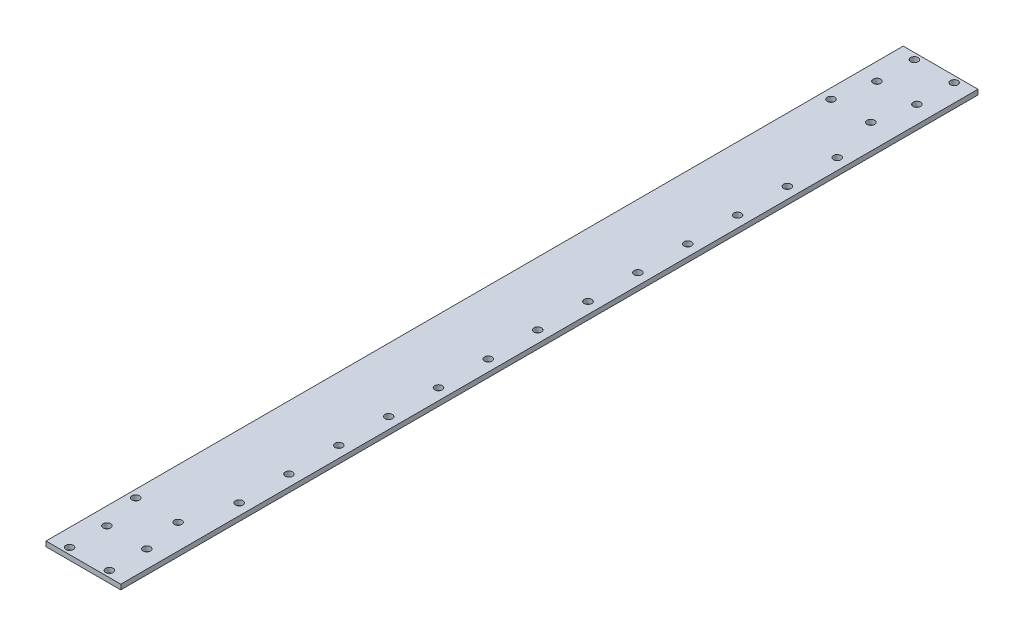
ISO-10303-21;
HEADER;
FILE_DESCRIPTION(('STEP AP214'),'2;1');
FILE_NAME('part.step','',(''),(''),'','','');
FILE_SCHEMA(('AUTOMOTIVE_DESIGN { 1 0 10303 214 1 1 1 1 }'));
ENDSEC;
DATA;
#1=APPLICATION_CONTEXT('core data for automotive mechanical design processes');
#2=APPLICATION_PROTOCOL_DEFINITION('international standard','automotive_design',2000,#1);
#3=PRODUCT_CONTEXT('',#1,'mechanical');
#4=PRODUCT('Part','Part','',(#3));
#5=PRODUCT_RELATED_PRODUCT_CATEGORY('part','',(#4));
#6=PRODUCT_DEFINITION_FORMATION('','',#4);
#7=PRODUCT_DEFINITION_CONTEXT('part definition',#1,'design');
#8=PRODUCT_DEFINITION('design','',#6,#7);
#9=PRODUCT_DEFINITION_SHAPE('','',#8);
#10=(LENGTH_UNIT() NAMED_UNIT(*) SI_UNIT(.MILLI.,.METRE.));
#11=(NAMED_UNIT(*) PLANE_ANGLE_UNIT() SI_UNIT($,.RADIAN.));
#12=(NAMED_UNIT(*) SI_UNIT($,.STERADIAN.) SOLID_ANGLE_UNIT());
#13=UNCERTAINTY_MEASURE_WITH_UNIT(LENGTH_MEASURE(1.E-05),#10,'distance_accuracy_value','');
#14=(GEOMETRIC_REPRESENTATION_CONTEXT(3) GLOBAL_UNCERTAINTY_ASSIGNED_CONTEXT((#13)) GLOBAL_UNIT_ASSIGNED_CONTEXT((#10,
#11,#12)) REPRESENTATION_CONTEXT('',''));
#15=CARTESIAN_POINT('',(0.,0.,0.));
#16=DIRECTION('',(0.,0.,1.));
#17=DIRECTION('',(1.,0.,0.));
#18=AXIS2_PLACEMENT_3D('',#15,#16,#17);
#19=CARTESIAN_POINT('',(14.9,-8.69999999999625,-143.999999999999));
#20=DIRECTION('',(0.,0.,-1.));
#21=DIRECTION('',(0.,1.,0.));
#22=AXIS2_PLACEMENT_3D('',#19,#20,#21);
#23=PLANE('',#22);
#24=DIRECTION('',(0.,-1.,0.));
#25=VECTOR('',#24,1.);
#26=CARTESIAN_POINT('',(-15.,-1.,-143.999999999999));
#27=LINE('',#26,#25);
#28=CARTESIAN_POINT('',(-15.,0.999999999999999,-143.999999999999));
#29=VERTEX_POINT('',#28);
#30=CARTESIAN_POINT('',(-15.,-1.,-143.999999999999));
#31=VERTEX_POINT('',#30);
#32=EDGE_CURVE('E44',#29,#31,#27,.T.);
#33=ORIENTED_EDGE('',*,*,#32,.F.);
#34=DIRECTION('',(-1.,0.,0.));
#35=VECTOR('',#34,1.);
#36=CARTESIAN_POINT('',(15.,1.,-143.999999999999));
#37=LINE('',#36,#35);
#38=CARTESIAN_POINT('',(15.,1.,-143.999999999999));
#39=VERTEX_POINT('',#38);
#40=EDGE_CURVE('E111',#39,#29,#37,.T.);
#41=ORIENTED_EDGE('',*,*,#40,.F.);
#42=DIRECTION('',(0.,1.,0.));
#43=VECTOR('',#42,1.);
#44=CARTESIAN_POINT('',(15.,-0.999999999999997,-143.999999999999));
#45=LINE('',#44,#43);
#46=CARTESIAN_POINT('',(15.,-0.999999999999997,-143.999999999999));
#47=VERTEX_POINT('',#46);
#48=EDGE_CURVE('E57',#47,#39,#45,.T.);
#49=ORIENTED_EDGE('',*,*,#48,.F.);
#50=DIRECTION('',(1.,0.,0.));
#51=VECTOR('',#50,1.);
#52=CARTESIAN_POINT('',(15.,-0.999999999999997,-143.999999999999));
#53=LINE('',#52,#51);
#54=EDGE_CURVE('E51',#31,#47,#53,.T.);
#55=ORIENTED_EDGE('',*,*,#54,.F.);
#56=EDGE_LOOP('',(#33,#41,#49,#55));
#57=FACE_BOUND('',#56,.T.);
#58=ADVANCED_FACE('F37',(#57),#23,.T.);
#59=CARTESIAN_POINT('',(15.,-0.999999999999997,-174.066592756745));
#60=DIRECTION('',(0.,-1.,0.));
#61=DIRECTION('',(1.,0.,0.));
#62=AXIS2_PLACEMENT_3D('',#59,#60,#61);
#63=PLANE('',#62);
#64=CARTESIAN_POINT('',(7.95000000000002,-1.,197.5));
#65=DIRECTION('',(0.,-1.,0.));
#66=DIRECTION('',(0.,0.,-1.));
#67=AXIS2_PLACEMENT_3D('',#64,#65,#66);
#68=CIRCLE('',#67,1.49999999999999);
#69=CARTESIAN_POINT('',(7.95000000000002,-1.,196.));
#70=VERTEX_POINT('',#69);
#71=EDGE_CURVE('E239',#70,#70,#68,.T.);
#72=ORIENTED_EDGE('',*,*,#71,.F.);
#73=EDGE_LOOP('',(#72));
#74=FACE_BOUND('',#73,.T.);
#75=CARTESIAN_POINT('',(-8.04999999999998,-1.,197.5));
#76=DIRECTION('',(0.,-1.,0.));
#77=DIRECTION('',(0.,0.,-1.));
#78=AXIS2_PLACEMENT_3D('',#75,#76,#77);
#79=CIRCLE('',#78,1.49999999999999);
#80=CARTESIAN_POINT('',(-8.04999999999998,-1.,196.));
#81=VERTEX_POINT('',#80);
#82=EDGE_CURVE('E243',#81,#81,#79,.T.);
#83=ORIENTED_EDGE('',*,*,#82,.F.);
#84=EDGE_LOOP('',(#83));
#85=FACE_BOUND('',#84,.T.);
#86=CARTESIAN_POINT('',(-8.04999999999998,-1.,182.5));
#87=DIRECTION('',(0.,-1.,0.));
#88=DIRECTION('',(0.,0.,-1.));
#89=AXIS2_PLACEMENT_3D('',#86,#87,#88);
#90=CIRCLE('',#89,1.49999999999999);
#91=CARTESIAN_POINT('',(-8.04999999999998,-1.,181.));
#92=VERTEX_POINT('',#91);
#93=EDGE_CURVE('E252',#92,#92,#90,.T.);
#94=ORIENTED_EDGE('',*,*,#93,.F.);
#95=EDGE_LOOP('',(#94));
#96=FACE_BOUND('',#95,.T.);
#97=CARTESIAN_POINT('',(7.95000000000002,-1.,182.5));
#98=DIRECTION('',(0.,-1.,0.));
#99=DIRECTION('',(0.,0.,-1.));
#100=AXIS2_PLACEMENT_3D('',#97,#98,#99);
#101=CIRCLE('',#100,1.49999999999999);
#102=CARTESIAN_POINT('',(7.95000000000002,-1.,181.));
#103=VERTEX_POINT('',#102);
#104=EDGE_CURVE('E258',#103,#103,#101,.T.);
#105=ORIENTED_EDGE('',*,*,#104,.F.);
#106=EDGE_LOOP('',(#105));
#107=FACE_BOUND('',#106,.T.);
#108=CARTESIAN_POINT('',(4.99999999999995,-1.,167.000000000001));
#109=DIRECTION('',(0.,-1.,0.));
#110=DIRECTION('',(0.,0.,-1.));
#111=AXIS2_PLACEMENT_3D('',#108,#109,#110);
#112=CIRCLE('',#111,1.49999999999999);
#113=CARTESIAN_POINT('',(4.99999999999995,-1.,165.500000000001));
#114=VERTEX_POINT('',#113);
#115=EDGE_CURVE('E264',#114,#114,#112,.T.);
#116=ORIENTED_EDGE('',*,*,#115,.F.);
#117=EDGE_LOOP('',(#116));
#118=FACE_BOUND('',#117,.T.);
#119=CARTESIAN_POINT('',(-12.0000000000001,-1.,167.000000000001));
#120=DIRECTION('',(0.,-1.,0.));
#121=DIRECTION('',(0.,0.,-1.));
#122=AXIS2_PLACEMENT_3D('',#119,#120,#121);
#123=CIRCLE('',#122,1.49999999999999);
#124=CARTESIAN_POINT('',(-12.0000000000001,-1.,165.500000000001));
#125=VERTEX_POINT('',#124);
#126=EDGE_CURVE('E270',#125,#125,#123,.T.);
#127=ORIENTED_EDGE('',*,*,#126,.F.);
#128=EDGE_LOOP('',(#127));
#129=FACE_BOUND('',#128,.T.);
#130=CARTESIAN_POINT('',(10.4999999999999,-0.999999999999999,148.000000000001));
#131=DIRECTION('',(0.,-1.,0.));
#132=DIRECTION('',(0.,0.,-1.));
#133=AXIS2_PLACEMENT_3D('',#130,#131,#132);
#134=CIRCLE('',#133,1.49999999999999);
#135=CARTESIAN_POINT('',(10.4999999999999,-0.999999999999999,146.500000000001));
#136=VERTEX_POINT('',#135);
#137=EDGE_CURVE('E276',#136,#136,#134,.T.);
#138=ORIENTED_EDGE('',*,*,#137,.F.);
#139=EDGE_LOOP('',(#138));
#140=FACE_BOUND('',#139,.T.);
#141=CARTESIAN_POINT('',(10.4999999999999,-0.999999999999999,128.000000000001));
#142=DIRECTION('',(0.,-1.,0.));
#143=DIRECTION('',(0.,0.,-1.));
#144=AXIS2_PLACEMENT_3D('',#141,#142,#143);
#145=CIRCLE('',#144,1.49999999999999);
#146=CARTESIAN_POINT('',(10.4999999999999,-0.999999999999999,126.500000000001));
#147=VERTEX_POINT('',#146);
#148=EDGE_CURVE('E282',#147,#147,#145,.T.);
#149=ORIENTED_EDGE('',*,*,#148,.F.);
#150=EDGE_LOOP('',(#149));
#151=FACE_BOUND('',#150,.T.);
#152=CARTESIAN_POINT('',(10.4999999999999,-0.999999999999999,108.000000000001));
#153=DIRECTION('',(0.,-1.,0.));
#154=DIRECTION('',(0.,0.,-1.));
#155=AXIS2_PLACEMENT_3D('',#152,#153,#154);
#156=CIRCLE('',#155,1.49999999999999);
#157=CARTESIAN_POINT('',(10.4999999999999,-0.999999999999999,106.500000000001));
#158=VERTEX_POINT('',#157);
#159=EDGE_CURVE('E288',#158,#158,#156,.T.);
#160=ORIENTED_EDGE('',*,*,#159,.F.);
#161=EDGE_LOOP('',(#160));
#162=FACE_BOUND('',#161,.T.);
#163=CARTESIAN_POINT('',(10.4999999999999,-0.999999999999999,88.000000000001));
#164=DIRECTION('',(0.,-1.,0.));
#165=DIRECTION('',(0.,0.,-1.));
#166=AXIS2_PLACEMENT_3D('',#163,#164,#165);
#167=CIRCLE('',#166,1.49999999999999);
#168=CARTESIAN_POINT('',(10.4999999999999,-0.999999999999999,86.500000000001));
#169=VERTEX_POINT('',#168);
#170=EDGE_CURVE('E294',#169,#169,#167,.T.);
#171=ORIENTED_EDGE('',*,*,#170,.F.);
#172=EDGE_LOOP('',(#171));
#173=FACE_BOUND('',#172,.T.);
#174=CARTESIAN_POINT('',(10.4999999999999,-0.999999999999999,68.000000000001));
#175=DIRECTION('',(0.,-1.,0.));
#176=DIRECTION('',(0.,0.,-1.));
#177=AXIS2_PLACEMENT_3D('',#174,#175,#176);
#178=CIRCLE('',#177,1.49999999999999);
#179=CARTESIAN_POINT('',(10.4999999999999,-0.999999999999999,66.500000000001));
#180=VERTEX_POINT('',#179);
#181=EDGE_CURVE('E300',#180,#180,#178,.T.);
#182=ORIENTED_EDGE('',*,*,#181,.F.);
#183=EDGE_LOOP('',(#182));
#184=FACE_BOUND('',#183,.T.);
#185=CARTESIAN_POINT('',(10.4999999999999,-0.999999999999999,48.0000000000009));
#186=DIRECTION('',(0.,-1.,0.));
#187=DIRECTION('',(0.,0.,-1.));
#188=AXIS2_PLACEMENT_3D('',#185,#186,#187);
#189=CIRCLE('',#188,1.49999999999999);
#190=CARTESIAN_POINT('',(10.4999999999999,-0.999999999999999,46.500000000001));
#191=VERTEX_POINT('',#190);
#192=EDGE_CURVE('E306',#191,#191,#189,.T.);
#193=ORIENTED_EDGE('',*,*,#192,.F.);
#194=EDGE_LOOP('',(#193));
#195=FACE_BOUND('',#194,.T.);
#196=CARTESIAN_POINT('',(10.2999999999999,-0.999999999999999,28.000000000001));
#197=DIRECTION('',(0.,-1.,0.));
#198=DIRECTION('',(0.,0.,-1.));
#199=AXIS2_PLACEMENT_3D('',#196,#197,#198);
#200=CIRCLE('',#199,1.49999999999999);
#201=CARTESIAN_POINT('',(10.2999999999999,-0.999999999999999,26.500000000001));
#202=VERTEX_POINT('',#201);
#203=EDGE_CURVE('E312',#202,#202,#200,.T.);
#204=ORIENTED_EDGE('',*,*,#203,.F.);
#205=EDGE_LOOP('',(#204));
#206=FACE_BOUND('',#205,.T.);
#207=CARTESIAN_POINT('',(10.4999999999999,-0.999999999999999,8.00000000000095));
#208=DIRECTION('',(0.,-1.,0.));
#209=DIRECTION('',(0.,0.,-1.));
#210=AXIS2_PLACEMENT_3D('',#207,#208,#209);
#211=CIRCLE('',#210,1.49999999999999);
#212=CARTESIAN_POINT('',(10.4999999999999,-0.999999999999999,6.50000000000096));
#213=VERTEX_POINT('',#212);
#214=EDGE_CURVE('E318',#213,#213,#211,.T.);
#215=ORIENTED_EDGE('',*,*,#214,.F.);
#216=EDGE_LOOP('',(#215));
#217=FACE_BOUND('',#216,.T.);
#218=CARTESIAN_POINT('',(10.4999999999999,-0.999999999999999,-11.9999999999991));
#219=DIRECTION('',(0.,-1.,0.));
#220=DIRECTION('',(0.,0.,-1.));
#221=AXIS2_PLACEMENT_3D('',#218,#219,#220);
#222=CIRCLE('',#221,1.49999999999999);
#223=CARTESIAN_POINT('',(10.4999999999999,-0.999999999999999,-13.4999999999991));
#224=VERTEX_POINT('',#223);
#225=EDGE_CURVE('E324',#224,#224,#222,.T.);
#226=ORIENTED_EDGE('',*,*,#225,.F.);
#227=EDGE_LOOP('',(#226));
#228=FACE_BOUND('',#227,.T.);
#229=CARTESIAN_POINT('',(10.4999999999999,-0.999999999999999,-31.9999999999991));
#230=DIRECTION('',(0.,-1.,0.));
#231=DIRECTION('',(0.,0.,-1.));
#232=AXIS2_PLACEMENT_3D('',#229,#230,#231);
#233=CIRCLE('',#232,1.49999999999999);
#234=CARTESIAN_POINT('',(10.4999999999999,-0.999999999999999,-33.499999999999));
#235=VERTEX_POINT('',#234);
#236=EDGE_CURVE('E330',#235,#235,#233,.T.);
#237=ORIENTED_EDGE('',*,*,#236,.F.);
#238=EDGE_LOOP('',(#237));
#239=FACE_BOUND('',#238,.T.);
#240=CARTESIAN_POINT('',(10.4999999999999,-0.999999999999999,-51.9999999999991));
#241=DIRECTION('',(0.,-1.,0.));
#242=DIRECTION('',(0.,0.,-1.));
#243=AXIS2_PLACEMENT_3D('',#240,#241,#242);
#244=CIRCLE('',#243,1.49999999999999);
#245=CARTESIAN_POINT('',(10.4999999999999,-0.999999999999999,-53.4999999999991));
#246=VERTEX_POINT('',#245);
#247=EDGE_CURVE('E336',#246,#246,#244,.T.);
#248=ORIENTED_EDGE('',*,*,#247,.F.);
#249=EDGE_LOOP('',(#248));
#250=FACE_BOUND('',#249,.T.);
#251=CARTESIAN_POINT('',(10.4999999999999,-0.999999999999999,-71.9999999999991));
#252=DIRECTION('',(0.,-1.,0.));
#253=DIRECTION('',(0.,0.,-1.));
#254=AXIS2_PLACEMENT_3D('',#251,#252,#253);
#255=CIRCLE('',#254,1.49999999999999);
#256=CARTESIAN_POINT('',(10.4999999999999,-0.999999999999999,-73.4999999999991));
#257=VERTEX_POINT('',#256);
#258=EDGE_CURVE('E342',#257,#257,#255,.T.);
#259=ORIENTED_EDGE('',*,*,#258,.F.);
#260=EDGE_LOOP('',(#259));
#261=FACE_BOUND('',#260,.T.);
#262=CARTESIAN_POINT('',(10.4999999999999,-0.999999999999999,-91.9999999999991));
#263=DIRECTION('',(0.,-1.,0.));
#264=DIRECTION('',(0.,0.,-1.));
#265=AXIS2_PLACEMENT_3D('',#262,#263,#264);
#266=CIRCLE('',#265,1.49999999999999);
#267=CARTESIAN_POINT('',(10.4999999999999,-0.999999999999999,-93.4999999999991));
#268=VERTEX_POINT('',#267);
#269=EDGE_CURVE('E348',#268,#268,#266,.T.);
#270=ORIENTED_EDGE('',*,*,#269,.F.);
#271=EDGE_LOOP('',(#270));
#272=FACE_BOUND('',#271,.T.);
#273=CARTESIAN_POINT('',(4.99999999999995,-1.,-110.999999999999));
#274=DIRECTION('',(0.,-1.,0.));
#275=DIRECTION('',(0.,0.,-1.));
#276=AXIS2_PLACEMENT_3D('',#273,#274,#275);
#277=CIRCLE('',#276,1.49999999999999);
#278=CARTESIAN_POINT('',(4.99999999999995,-1.,-112.499999999999));
#279=VERTEX_POINT('',#278);
#280=EDGE_CURVE('E354',#279,#279,#277,.T.);
#281=ORIENTED_EDGE('',*,*,#280,.F.);
#282=EDGE_LOOP('',(#281));
#283=FACE_BOUND('',#282,.T.);
#284=CARTESIAN_POINT('',(-11.,-1.,-110.999999999999));
#285=DIRECTION('',(0.,-1.,0.));
#286=DIRECTION('',(0.,0.,-1.));
#287=AXIS2_PLACEMENT_3D('',#284,#285,#286);
#288=CIRCLE('',#287,1.49999999999999);
#289=CARTESIAN_POINT('',(-11.,-1.,-112.499999999999));
#290=VERTEX_POINT('',#289);
#291=EDGE_CURVE('E360',#290,#290,#288,.T.);
#292=ORIENTED_EDGE('',*,*,#291,.F.);
#293=EDGE_LOOP('',(#292));
#294=FACE_BOUND('',#293,.T.);
#295=CARTESIAN_POINT('',(-8.04999999999987,-1.,-126.5));
#296=DIRECTION('',(0.,1.,0.));
#297=DIRECTION('',(0.,0.,1.));
#298=AXIS2_PLACEMENT_3D('',#295,#296,#297);
#299=CIRCLE('',#298,1.5);
#300=CARTESIAN_POINT('',(-8.04999999999987,-1.,-125.));
#301=VERTEX_POINT('',#300);
#302=EDGE_CURVE('E369',#301,#301,#299,.T.);
#303=ORIENTED_EDGE('',*,*,#302,.T.);
#304=EDGE_LOOP('',(#303));
#305=FACE_BOUND('',#304,.T.);
#306=CARTESIAN_POINT('',(7.95000000000013,-1.,-126.5));
#307=DIRECTION('',(0.,1.,0.));
#308=DIRECTION('',(0.,0.,1.));
#309=AXIS2_PLACEMENT_3D('',#306,#307,#308);
#310=CIRCLE('',#309,1.5);
#311=CARTESIAN_POINT('',(7.95000000000013,-1.,-125.));
#312=VERTEX_POINT('',#311);
#313=EDGE_CURVE('E375',#312,#312,#310,.T.);
#314=ORIENTED_EDGE('',*,*,#313,.T.);
#315=EDGE_LOOP('',(#314));
#316=FACE_BOUND('',#315,.T.);
#317=CARTESIAN_POINT('',(7.95000000000013,-1.,-141.5));
#318=DIRECTION('',(0.,1.,0.));
#319=DIRECTION('',(0.,0.,1.));
#320=AXIS2_PLACEMENT_3D('',#317,#318,#319);
#321=CIRCLE('',#320,1.5);
#322=CARTESIAN_POINT('',(7.95000000000013,-1.,-140.));
#323=VERTEX_POINT('',#322);
#324=EDGE_CURVE('E381',#323,#323,#321,.T.);
#325=ORIENTED_EDGE('',*,*,#324,.T.);
#326=EDGE_LOOP('',(#325));
#327=FACE_BOUND('',#326,.T.);
#328=CARTESIAN_POINT('',(-8.04999999999987,-1.,-141.5));
#329=DIRECTION('',(0.,1.,0.));
#330=DIRECTION('',(0.,0.,1.));
#331=AXIS2_PLACEMENT_3D('',#328,#329,#330);
#332=CIRCLE('',#331,1.5);
#333=CARTESIAN_POINT('',(-8.04999999999987,-1.,-140.));
#334=VERTEX_POINT('',#333);
#335=EDGE_CURVE('E100',#334,#334,#332,.T.);
#336=ORIENTED_EDGE('',*,*,#335,.T.);
#337=EDGE_LOOP('',(#336));
#338=FACE_BOUND('',#337,.T.);
#339=DIRECTION('',(0.,0.,1.));
#340=VECTOR('',#339,1.);
#341=CARTESIAN_POINT('',(-15.,-1.,-174.066592756745));
#342=LINE('',#341,#340);
#343=CARTESIAN_POINT('',(-15.,-1.,200.));
#344=VERTEX_POINT('',#343);
#345=EDGE_CURVE('E11',#31,#344,#342,.T.);
#346=ORIENTED_EDGE('',*,*,#345,.F.);
#347=ORIENTED_EDGE('',*,*,#54,.T.);
#348=DIRECTION('',(0.,0.,1.));
#349=VECTOR('',#348,1.);
#350=CARTESIAN_POINT('',(15.,-0.999999999999997,-174.066592756745));
#351=LINE('',#350,#349);
#352=CARTESIAN_POINT('',(15.,-0.999999999999997,200.));
#353=VERTEX_POINT('',#352);
#354=EDGE_CURVE('E94',#47,#353,#351,.T.);
#355=ORIENTED_EDGE('',*,*,#354,.T.);
#356=DIRECTION('',(1.,0.,0.));
#357=VECTOR('',#356,1.);
#358=CARTESIAN_POINT('',(15.,-0.999999999999997,200.));
#359=LINE('',#358,#357);
#360=EDGE_CURVE('E92',#344,#353,#359,.T.);
#361=ORIENTED_EDGE('',*,*,#360,.F.);
#362=EDGE_LOOP('',(#346,#347,#355,#361));
#363=FACE_BOUND('',#362,.T.);
#364=ADVANCED_FACE('F93',(#74,#85,#96,#107,#118,#129,#140,#151,#162,#173,#184,#195,#206,#217,
#228,#239,#250,#261,#272,#283,#294,#305,#316,#327,#338,#363),#63,.T.);
#365=CARTESIAN_POINT('',(15.,-0.999999999999997,-174.066592756745));
#366=DIRECTION('',(1.,0.,0.));
#367=DIRECTION('',(0.,0.,-1.));
#368=AXIS2_PLACEMENT_3D('',#365,#366,#367);
#369=PLANE('',#368);
#370=ORIENTED_EDGE('',*,*,#354,.F.);
#371=ORIENTED_EDGE('',*,*,#48,.T.);
#372=DIRECTION('',(0.,0.,1.));
#373=VECTOR('',#372,1.);
#374=CARTESIAN_POINT('',(15.,1.,-174.066592756745));
#375=LINE('',#374,#373);
#376=CARTESIAN_POINT('',(15.,1.,200.));
#377=VERTEX_POINT('',#376);
#378=EDGE_CURVE('E77',#39,#377,#375,.T.);
#379=ORIENTED_EDGE('',*,*,#378,.T.);
#380=DIRECTION('',(0.,1.,0.));
#381=VECTOR('',#380,1.);
#382=CARTESIAN_POINT('',(15.,-0.999999999999997,200.));
#383=LINE('',#382,#381);
#384=EDGE_CURVE('E96',#353,#377,#383,.T.);
#385=ORIENTED_EDGE('',*,*,#384,.F.);
#386=EDGE_LOOP('',(#370,#371,#379,#385));
#387=FACE_BOUND('',#386,.T.);
#388=ADVANCED_FACE('F115',(#387),#369,.T.);
#389=CARTESIAN_POINT('',(15.,1.,-174.066592756745));
#390=DIRECTION('',(0.,1.,0.));
#391=DIRECTION('',(-1.,0.,0.));
#392=AXIS2_PLACEMENT_3D('',#389,#390,#391);
#393=PLANE('',#392);
#394=CARTESIAN_POINT('',(7.95000000000002,1.,197.5));
#395=DIRECTION('',(0.,1.,0.));
#396=DIRECTION('',(-1.,0.,0.));
#397=AXIS2_PLACEMENT_3D('',#394,#395,#396);
#398=CIRCLE('',#397,1.49999999999999);
#399=CARTESIAN_POINT('',(6.45000000000002,1.,197.5));
#400=VERTEX_POINT('',#399);
#401=EDGE_CURVE('E242',#400,#400,#398,.T.);
#402=ORIENTED_EDGE('',*,*,#401,.F.);
#403=EDGE_LOOP('',(#402));
#404=FACE_BOUND('',#403,.T.);
#405=CARTESIAN_POINT('',(-8.04999999999998,1.,197.5));
#406=DIRECTION('',(0.,1.,0.));
#407=DIRECTION('',(-1.,0.,0.));
#408=AXIS2_PLACEMENT_3D('',#405,#406,#407);
#409=CIRCLE('',#408,1.49999999999999);
#410=CARTESIAN_POINT('',(-9.54999999999998,1.,197.5));
#411=VERTEX_POINT('',#410);
#412=EDGE_CURVE('E246',#411,#411,#409,.T.);
#413=ORIENTED_EDGE('',*,*,#412,.F.);
#414=EDGE_LOOP('',(#413));
#415=FACE_BOUND('',#414,.T.);
#416=CARTESIAN_POINT('',(-8.04999999999998,1.,182.5));
#417=DIRECTION('',(0.,1.,0.));
#418=DIRECTION('',(-1.,0.,0.));
#419=AXIS2_PLACEMENT_3D('',#416,#417,#418);
#420=CIRCLE('',#419,1.49999999999999);
#421=CARTESIAN_POINT('',(-9.54999999999998,1.,182.5));
#422=VERTEX_POINT('',#421);
#423=EDGE_CURVE('E255',#422,#422,#420,.T.);
#424=ORIENTED_EDGE('',*,*,#423,.F.);
#425=EDGE_LOOP('',(#424));
#426=FACE_BOUND('',#425,.T.);
#427=CARTESIAN_POINT('',(7.95000000000002,1.,182.5));
#428=DIRECTION('',(0.,1.,0.));
#429=DIRECTION('',(-1.,0.,0.));
#430=AXIS2_PLACEMENT_3D('',#427,#428,#429);
#431=CIRCLE('',#430,1.49999999999999);
#432=CARTESIAN_POINT('',(6.45000000000002,1.,182.5));
#433=VERTEX_POINT('',#432);
#434=EDGE_CURVE('E261',#433,#433,#431,.T.);
#435=ORIENTED_EDGE('',*,*,#434,.F.);
#436=EDGE_LOOP('',(#435));
#437=FACE_BOUND('',#436,.T.);
#438=CARTESIAN_POINT('',(4.99999999999995,1.,167.000000000001));
#439=DIRECTION('',(0.,1.,0.));
#440=DIRECTION('',(-1.,0.,0.));
#441=AXIS2_PLACEMENT_3D('',#438,#439,#440);
#442=CIRCLE('',#441,1.49999999999999);
#443=CARTESIAN_POINT('',(3.49999999999996,1.,167.000000000001));
#444=VERTEX_POINT('',#443);
#445=EDGE_CURVE('E267',#444,#444,#442,.T.);
#446=ORIENTED_EDGE('',*,*,#445,.F.);
#447=EDGE_LOOP('',(#446));
#448=FACE_BOUND('',#447,.T.);
#449=CARTESIAN_POINT('',(-12.0000000000001,1.,167.000000000001));
#450=DIRECTION('',(0.,1.,0.));
#451=DIRECTION('',(-1.,0.,0.));
#452=AXIS2_PLACEMENT_3D('',#449,#450,#451);
#453=CIRCLE('',#452,1.49999999999999);
#454=CARTESIAN_POINT('',(-13.5000000000001,0.999999999999999,167.000000000001));
#455=VERTEX_POINT('',#454);
#456=EDGE_CURVE('E273',#455,#455,#453,.T.);
#457=ORIENTED_EDGE('',*,*,#456,.F.);
#458=EDGE_LOOP('',(#457));
#459=FACE_BOUND('',#458,.T.);
#460=CARTESIAN_POINT('',(10.4999999999999,1.,148.000000000001));
#461=DIRECTION('',(0.,1.,0.));
#462=DIRECTION('',(-1.,0.,0.));
#463=AXIS2_PLACEMENT_3D('',#460,#461,#462);
#464=CIRCLE('',#463,1.49999999999999);
#465=CARTESIAN_POINT('',(8.99999999999988,1.,148.000000000001));
#466=VERTEX_POINT('',#465);
#467=EDGE_CURVE('E279',#466,#466,#464,.T.);
#468=ORIENTED_EDGE('',*,*,#467,.F.);
#469=EDGE_LOOP('',(#468));
#470=FACE_BOUND('',#469,.T.);
#471=CARTESIAN_POINT('',(10.4999999999999,1.,128.000000000001));
#472=DIRECTION('',(0.,1.,0.));
#473=DIRECTION('',(-1.,0.,0.));
#474=AXIS2_PLACEMENT_3D('',#471,#472,#473);
#475=CIRCLE('',#474,1.49999999999999);
#476=CARTESIAN_POINT('',(8.99999999999988,1.,128.000000000001));
#477=VERTEX_POINT('',#476);
#478=EDGE_CURVE('E285',#477,#477,#475,.T.);
#479=ORIENTED_EDGE('',*,*,#478,.F.);
#480=EDGE_LOOP('',(#479));
#481=FACE_BOUND('',#480,.T.);
#482=CARTESIAN_POINT('',(10.4999999999999,1.,108.000000000001));
#483=DIRECTION('',(0.,1.,0.));
#484=DIRECTION('',(-1.,0.,0.));
#485=AXIS2_PLACEMENT_3D('',#482,#483,#484);
#486=CIRCLE('',#485,1.49999999999999);
#487=CARTESIAN_POINT('',(8.99999999999988,1.,108.000000000001));
#488=VERTEX_POINT('',#487);
#489=EDGE_CURVE('E291',#488,#488,#486,.T.);
#490=ORIENTED_EDGE('',*,*,#489,.F.);
#491=EDGE_LOOP('',(#490));
#492=FACE_BOUND('',#491,.T.);
#493=CARTESIAN_POINT('',(10.4999999999999,1.,88.000000000001));
#494=DIRECTION('',(0.,1.,0.));
#495=DIRECTION('',(-1.,0.,0.));
#496=AXIS2_PLACEMENT_3D('',#493,#494,#495);
#497=CIRCLE('',#496,1.49999999999999);
#498=CARTESIAN_POINT('',(8.99999999999988,1.,88.000000000001));
#499=VERTEX_POINT('',#498);
#500=EDGE_CURVE('E297',#499,#499,#497,.T.);
#501=ORIENTED_EDGE('',*,*,#500,.F.);
#502=EDGE_LOOP('',(#501));
#503=FACE_BOUND('',#502,.T.);
#504=CARTESIAN_POINT('',(10.4999999999999,1.,68.000000000001));
#505=DIRECTION('',(0.,1.,0.));
#506=DIRECTION('',(-1.,0.,0.));
#507=AXIS2_PLACEMENT_3D('',#504,#505,#506);
#508=CIRCLE('',#507,1.49999999999999);
#509=CARTESIAN_POINT('',(8.99999999999989,1.,68.000000000001));
#510=VERTEX_POINT('',#509);
#511=EDGE_CURVE('E303',#510,#510,#508,.T.);
#512=ORIENTED_EDGE('',*,*,#511,.F.);
#513=EDGE_LOOP('',(#512));
#514=FACE_BOUND('',#513,.T.);
#515=CARTESIAN_POINT('',(10.4999999999999,1.,48.0000000000009));
#516=DIRECTION('',(0.,1.,0.));
#517=DIRECTION('',(-1.,0.,0.));
#518=AXIS2_PLACEMENT_3D('',#515,#516,#517);
#519=CIRCLE('',#518,1.49999999999999);
#520=CARTESIAN_POINT('',(8.99999999999989,1.,48.0000000000009));
#521=VERTEX_POINT('',#520);
#522=EDGE_CURVE('E309',#521,#521,#519,.T.);
#523=ORIENTED_EDGE('',*,*,#522,.F.);
#524=EDGE_LOOP('',(#523));
#525=FACE_BOUND('',#524,.T.);
#526=CARTESIAN_POINT('',(10.2999999999999,1.,28.000000000001));
#527=DIRECTION('',(0.,1.,0.));
#528=DIRECTION('',(-1.,0.,0.));
#529=AXIS2_PLACEMENT_3D('',#526,#527,#528);
#530=CIRCLE('',#529,1.49999999999999);
#531=CARTESIAN_POINT('',(8.79999999999988,1.,28.000000000001));
#532=VERTEX_POINT('',#531);
#533=EDGE_CURVE('E315',#532,#532,#530,.T.);
#534=ORIENTED_EDGE('',*,*,#533,.F.);
#535=EDGE_LOOP('',(#534));
#536=FACE_BOUND('',#535,.T.);
#537=CARTESIAN_POINT('',(10.4999999999999,1.,8.00000000000095));
#538=DIRECTION('',(0.,1.,0.));
#539=DIRECTION('',(-1.,0.,0.));
#540=AXIS2_PLACEMENT_3D('',#537,#538,#539);
#541=CIRCLE('',#540,1.49999999999999);
#542=CARTESIAN_POINT('',(8.99999999999989,1.,8.00000000000095));
#543=VERTEX_POINT('',#542);
#544=EDGE_CURVE('E321',#543,#543,#541,.T.);
#545=ORIENTED_EDGE('',*,*,#544,.F.);
#546=EDGE_LOOP('',(#545));
#547=FACE_BOUND('',#546,.T.);
#548=CARTESIAN_POINT('',(10.4999999999999,1.,-11.9999999999991));
#549=DIRECTION('',(0.,1.,0.));
#550=DIRECTION('',(-1.,0.,0.));
#551=AXIS2_PLACEMENT_3D('',#548,#549,#550);
#552=CIRCLE('',#551,1.49999999999999);
#553=CARTESIAN_POINT('',(8.99999999999989,1.,-11.9999999999991));
#554=VERTEX_POINT('',#553);
#555=EDGE_CURVE('E327',#554,#554,#552,.T.);
#556=ORIENTED_EDGE('',*,*,#555,.F.);
#557=EDGE_LOOP('',(#556));
#558=FACE_BOUND('',#557,.T.);
#559=CARTESIAN_POINT('',(10.4999999999999,1.,-31.9999999999991));
#560=DIRECTION('',(0.,1.,0.));
#561=DIRECTION('',(-1.,0.,0.));
#562=AXIS2_PLACEMENT_3D('',#559,#560,#561);
#563=CIRCLE('',#562,1.49999999999999);
#564=CARTESIAN_POINT('',(8.9999999999999,1.,-31.9999999999991));
#565=VERTEX_POINT('',#564);
#566=EDGE_CURVE('E333',#565,#565,#563,.T.);
#567=ORIENTED_EDGE('',*,*,#566,.F.);
#568=EDGE_LOOP('',(#567));
#569=FACE_BOUND('',#568,.T.);
#570=CARTESIAN_POINT('',(10.4999999999999,1.,-51.9999999999991));
#571=DIRECTION('',(0.,1.,0.));
#572=DIRECTION('',(-1.,0.,0.));
#573=AXIS2_PLACEMENT_3D('',#570,#571,#572);
#574=CIRCLE('',#573,1.49999999999999);
#575=CARTESIAN_POINT('',(8.9999999999999,1.,-51.9999999999991));
#576=VERTEX_POINT('',#575);
#577=EDGE_CURVE('E339',#576,#576,#574,.T.);
#578=ORIENTED_EDGE('',*,*,#577,.F.);
#579=EDGE_LOOP('',(#578));
#580=FACE_BOUND('',#579,.T.);
#581=CARTESIAN_POINT('',(10.4999999999999,1.,-71.9999999999991));
#582=DIRECTION('',(0.,1.,0.));
#583=DIRECTION('',(-1.,0.,0.));
#584=AXIS2_PLACEMENT_3D('',#581,#582,#583);
#585=CIRCLE('',#584,1.49999999999999);
#586=CARTESIAN_POINT('',(8.9999999999999,1.,-71.9999999999991));
#587=VERTEX_POINT('',#586);
#588=EDGE_CURVE('E345',#587,#587,#585,.T.);
#589=ORIENTED_EDGE('',*,*,#588,.F.);
#590=EDGE_LOOP('',(#589));
#591=FACE_BOUND('',#590,.T.);
#592=CARTESIAN_POINT('',(10.4999999999999,1.,-91.9999999999991));
#593=DIRECTION('',(0.,1.,0.));
#594=DIRECTION('',(-1.,0.,0.));
#595=AXIS2_PLACEMENT_3D('',#592,#593,#594);
#596=CIRCLE('',#595,1.49999999999999);
#597=CARTESIAN_POINT('',(8.9999999999999,1.,-91.9999999999991));
#598=VERTEX_POINT('',#597);
#599=EDGE_CURVE('E351',#598,#598,#596,.T.);
#600=ORIENTED_EDGE('',*,*,#599,.F.);
#601=EDGE_LOOP('',(#600));
#602=FACE_BOUND('',#601,.T.);
#603=CARTESIAN_POINT('',(4.99999999999995,1.,-110.999999999999));
#604=DIRECTION('',(0.,1.,0.));
#605=DIRECTION('',(-1.,0.,0.));
#606=AXIS2_PLACEMENT_3D('',#603,#604,#605);
#607=CIRCLE('',#606,1.49999999999999);
#608=CARTESIAN_POINT('',(3.49999999999996,1.,-110.999999999999));
#609=VERTEX_POINT('',#608);
#610=EDGE_CURVE('E357',#609,#609,#607,.T.);
#611=ORIENTED_EDGE('',*,*,#610,.F.);
#612=EDGE_LOOP('',(#611));
#613=FACE_BOUND('',#612,.T.);
#614=CARTESIAN_POINT('',(-11.,1.,-110.999999999999));
#615=DIRECTION('',(0.,1.,0.));
#616=DIRECTION('',(-1.,0.,0.));
#617=AXIS2_PLACEMENT_3D('',#614,#615,#616);
#618=CIRCLE('',#617,1.49999999999999);
#619=CARTESIAN_POINT('',(-12.5,0.999999999999999,-110.999999999999));
#620=VERTEX_POINT('',#619);
#621=EDGE_CURVE('E363',#620,#620,#618,.T.);
#622=ORIENTED_EDGE('',*,*,#621,.F.);
#623=EDGE_LOOP('',(#622));
#624=FACE_BOUND('',#623,.T.);
#625=CARTESIAN_POINT('',(-8.04999999999987,1.,-126.5));
#626=DIRECTION('',(0.,1.,0.));
#627=DIRECTION('',(0.,0.,1.));
#628=AXIS2_PLACEMENT_3D('',#625,#626,#627);
#629=CIRCLE('',#628,1.49999999999999);
#630=CARTESIAN_POINT('',(-8.04999999999987,1.,-125.));
#631=VERTEX_POINT('',#630);
#632=EDGE_CURVE('E366',#631,#631,#629,.T.);
#633=ORIENTED_EDGE('',*,*,#632,.F.);
#634=EDGE_LOOP('',(#633));
#635=FACE_BOUND('',#634,.T.);
#636=CARTESIAN_POINT('',(7.95000000000013,1.,-126.5));
#637=DIRECTION('',(0.,1.,0.));
#638=DIRECTION('',(0.,0.,1.));
#639=AXIS2_PLACEMENT_3D('',#636,#637,#638);
#640=CIRCLE('',#639,1.49999999999999);
#641=CARTESIAN_POINT('',(7.95000000000013,1.,-125.));
#642=VERTEX_POINT('',#641);
#643=EDGE_CURVE('E372',#642,#642,#640,.T.);
#644=ORIENTED_EDGE('',*,*,#643,.F.);
#645=EDGE_LOOP('',(#644));
#646=FACE_BOUND('',#645,.T.);
#647=CARTESIAN_POINT('',(7.95000000000013,1.,-141.5));
#648=DIRECTION('',(0.,1.,0.));
#649=DIRECTION('',(0.,0.,1.));
#650=AXIS2_PLACEMENT_3D('',#647,#648,#649);
#651=CIRCLE('',#650,1.49999999999999);
#652=CARTESIAN_POINT('',(7.95000000000013,1.,-140.));
#653=VERTEX_POINT('',#652);
#654=EDGE_CURVE('E378',#653,#653,#651,.T.);
#655=ORIENTED_EDGE('',*,*,#654,.F.);
#656=EDGE_LOOP('',(#655));
#657=FACE_BOUND('',#656,.T.);
#658=CARTESIAN_POINT('',(-8.04999999999987,1.,-141.5));
#659=DIRECTION('',(0.,1.,0.));
#660=DIRECTION('',(0.,0.,1.));
#661=AXIS2_PLACEMENT_3D('',#658,#659,#660);
#662=CIRCLE('',#661,1.49999999999999);
#663=CARTESIAN_POINT('',(-8.04999999999987,1.,-140.));
#664=VERTEX_POINT('',#663);
#665=EDGE_CURVE('E103',#664,#664,#662,.T.);
#666=ORIENTED_EDGE('',*,*,#665,.F.);
#667=EDGE_LOOP('',(#666));
#668=FACE_BOUND('',#667,.T.);
#669=ORIENTED_EDGE('',*,*,#378,.F.);
#670=ORIENTED_EDGE('',*,*,#40,.T.);
#671=DIRECTION('',(0.,0.,1.));
#672=VECTOR('',#671,1.);
#673=CARTESIAN_POINT('',(-15.,0.999999999999999,-174.066592756745));
#674=LINE('',#673,#672);
#675=CARTESIAN_POINT('',(-15.,0.999999999999999,200.));
#676=VERTEX_POINT('',#675);
#677=EDGE_CURVE('E70',#29,#676,#674,.T.);
#678=ORIENTED_EDGE('',*,*,#677,.T.);
#679=DIRECTION('',(-1.,0.,0.));
#680=VECTOR('',#679,1.);
#681=CARTESIAN_POINT('',(15.,1.,200.));
#682=LINE('',#681,#680);
#683=EDGE_CURVE('E99',#377,#676,#682,.T.);
#684=ORIENTED_EDGE('',*,*,#683,.F.);
#685=EDGE_LOOP('',(#669,#670,#678,#684));
#686=FACE_BOUND('',#685,.T.);
#687=ADVANCED_FACE('F116',(#404,#415,#426,#437,#448,#459,#470,#481,#492,#503,#514,#525,#536,
#547,#558,#569,#580,#591,#602,#613,#624,#635,#646,#657,#668,#686),#393,.T.);
#688=CARTESIAN_POINT('',(-15.,-1.,-174.066592756745));
#689=DIRECTION('',(-1.,0.,0.));
#690=DIRECTION('',(0.,0.,1.));
#691=AXIS2_PLACEMENT_3D('',#688,#689,#690);
#692=PLANE('',#691);
#693=ORIENTED_EDGE('',*,*,#677,.F.);
#694=ORIENTED_EDGE('',*,*,#32,.T.);
#695=ORIENTED_EDGE('',*,*,#345,.T.);
#696=DIRECTION('',(0.,-1.,0.));
#697=VECTOR('',#696,1.);
#698=CARTESIAN_POINT('',(-15.,-1.,200.));
#699=LINE('',#698,#697);
#700=EDGE_CURVE('E89',#676,#344,#699,.T.);
#701=ORIENTED_EDGE('',*,*,#700,.F.);
#702=EDGE_LOOP('',(#693,#694,#695,#701));
#703=FACE_BOUND('',#702,.T.);
#704=ADVANCED_FACE('F87',(#703),#692,.T.);
#705=CARTESIAN_POINT('',(0.,0.,200.));
#706=DIRECTION('',(0.,0.,1.));
#707=DIRECTION('',(1.,0.,0.));
#708=AXIS2_PLACEMENT_3D('',#705,#706,#707);
#709=PLANE('',#708);
#710=ORIENTED_EDGE('',*,*,#700,.T.);
#711=ORIENTED_EDGE('',*,*,#360,.T.);
#712=ORIENTED_EDGE('',*,*,#384,.T.);
#713=ORIENTED_EDGE('',*,*,#683,.T.);
#714=EDGE_LOOP('',(#710,#711,#712,#713));
#715=FACE_BOUND('',#714,.T.);
#716=ADVANCED_FACE('F98',(#715),#709,.T.);
#717=CARTESIAN_POINT('',(-8.04999999999987,1.,-141.5));
#718=DIRECTION('',(0.,1.,0.));
#719=DIRECTION('',(0.,0.,1.));
#720=AXIS2_PLACEMENT_3D('',#717,#718,#719);
#721=CYLINDRICAL_SURFACE('',#720,1.49999999999999);
#722=ORIENTED_EDGE('',*,*,#335,.F.);
#723=EDGE_LOOP('',(#722));
#724=FACE_BOUND('',#723,.T.);
#725=ORIENTED_EDGE('',*,*,#665,.T.);
#726=EDGE_LOOP('',(#725));
#727=FACE_BOUND('',#726,.T.);
#728=ADVANCED_FACE('F136',(#724,#727),#721,.F.);
#729=CARTESIAN_POINT('',(7.95000000000013,1.,-141.5));
#730=DIRECTION('',(0.,1.,0.));
#731=DIRECTION('',(0.,0.,1.));
#732=AXIS2_PLACEMENT_3D('',#729,#730,#731);
#733=CYLINDRICAL_SURFACE('',#732,1.49999999999999);
#734=ORIENTED_EDGE('',*,*,#324,.F.);
#735=EDGE_LOOP('',(#734));
#736=FACE_BOUND('',#735,.T.);
#737=ORIENTED_EDGE('',*,*,#654,.T.);
#738=EDGE_LOOP('',(#737));
#739=FACE_BOUND('',#738,.T.);
#740=ADVANCED_FACE('F139',(#736,#739),#733,.F.);
#741=CARTESIAN_POINT('',(7.95000000000013,1.,-126.5));
#742=DIRECTION('',(0.,1.,0.));
#743=DIRECTION('',(0.,0.,1.));
#744=AXIS2_PLACEMENT_3D('',#741,#742,#743);
#745=CYLINDRICAL_SURFACE('',#744,1.49999999999999);
#746=ORIENTED_EDGE('',*,*,#313,.F.);
#747=EDGE_LOOP('',(#746));
#748=FACE_BOUND('',#747,.T.);
#749=ORIENTED_EDGE('',*,*,#643,.T.);
#750=EDGE_LOOP('',(#749));
#751=FACE_BOUND('',#750,.T.);
#752=ADVANCED_FACE('F143',(#748,#751),#745,.F.);
#753=CARTESIAN_POINT('',(-8.04999999999987,1.,-126.5));
#754=DIRECTION('',(0.,1.,0.));
#755=DIRECTION('',(0.,0.,1.));
#756=AXIS2_PLACEMENT_3D('',#753,#754,#755);
#757=CYLINDRICAL_SURFACE('',#756,1.49999999999999);
#758=ORIENTED_EDGE('',*,*,#302,.F.);
#759=EDGE_LOOP('',(#758));
#760=FACE_BOUND('',#759,.T.);
#761=ORIENTED_EDGE('',*,*,#632,.T.);
#762=EDGE_LOOP('',(#761));
#763=FACE_BOUND('',#762,.T.);
#764=ADVANCED_FACE('F147',(#760,#763),#757,.F.);
#765=CARTESIAN_POINT('',(-11.,-1.,-110.999999999999));
#766=DIRECTION('',(0.,-1.,0.));
#767=DIRECTION('',(0.,0.,-1.));
#768=AXIS2_PLACEMENT_3D('',#765,#766,#767);
#769=CYLINDRICAL_SURFACE('',#768,1.49999999999999);
#770=ORIENTED_EDGE('',*,*,#291,.T.);
#771=EDGE_LOOP('',(#770));
#772=FACE_BOUND('',#771,.T.);
#773=ORIENTED_EDGE('',*,*,#621,.T.);
#774=EDGE_LOOP('',(#773));
#775=FACE_BOUND('',#774,.T.);
#776=ADVANCED_FACE('F151',(#772,#775),#769,.F.);
#777=CARTESIAN_POINT('',(4.99999999999995,-0.999999999999999,-110.999999999999));
#778=DIRECTION('',(0.,-1.,0.));
#779=DIRECTION('',(0.,0.,-1.));
#780=AXIS2_PLACEMENT_3D('',#777,#778,#779);
#781=CYLINDRICAL_SURFACE('',#780,1.49999999999999);
#782=ORIENTED_EDGE('',*,*,#280,.T.);
#783=EDGE_LOOP('',(#782));
#784=FACE_BOUND('',#783,.T.);
#785=ORIENTED_EDGE('',*,*,#610,.T.);
#786=EDGE_LOOP('',(#785));
#787=FACE_BOUND('',#786,.T.);
#788=ADVANCED_FACE('F155',(#784,#787),#781,.F.);
#789=CARTESIAN_POINT('',(10.4999999999999,-0.999999999999998,-91.9999999999991));
#790=DIRECTION('',(0.,-1.,0.));
#791=DIRECTION('',(0.,0.,-1.));
#792=AXIS2_PLACEMENT_3D('',#789,#790,#791);
#793=CYLINDRICAL_SURFACE('',#792,1.49999999999999);
#794=ORIENTED_EDGE('',*,*,#269,.T.);
#795=EDGE_LOOP('',(#794));
#796=FACE_BOUND('',#795,.T.);
#797=ORIENTED_EDGE('',*,*,#599,.T.);
#798=EDGE_LOOP('',(#797));
#799=FACE_BOUND('',#798,.T.);
#800=ADVANCED_FACE('F159',(#796,#799),#793,.F.);
#801=CARTESIAN_POINT('',(10.4999999999999,-0.999999999999998,-71.9999999999991));
#802=DIRECTION('',(0.,-1.,0.));
#803=DIRECTION('',(0.,0.,-1.));
#804=AXIS2_PLACEMENT_3D('',#801,#802,#803);
#805=CYLINDRICAL_SURFACE('',#804,1.49999999999999);
#806=ORIENTED_EDGE('',*,*,#258,.T.);
#807=EDGE_LOOP('',(#806));
#808=FACE_BOUND('',#807,.T.);
#809=ORIENTED_EDGE('',*,*,#588,.T.);
#810=EDGE_LOOP('',(#809));
#811=FACE_BOUND('',#810,.T.);
#812=ADVANCED_FACE('F163',(#808,#811),#805,.F.);
#813=CARTESIAN_POINT('',(10.4999999999999,-0.999999999999998,-51.9999999999991));
#814=DIRECTION('',(0.,-1.,0.));
#815=DIRECTION('',(0.,0.,-1.));
#816=AXIS2_PLACEMENT_3D('',#813,#814,#815);
#817=CYLINDRICAL_SURFACE('',#816,1.49999999999999);
#818=ORIENTED_EDGE('',*,*,#247,.T.);
#819=EDGE_LOOP('',(#818));
#820=FACE_BOUND('',#819,.T.);
#821=ORIENTED_EDGE('',*,*,#577,.T.);
#822=EDGE_LOOP('',(#821));
#823=FACE_BOUND('',#822,.T.);
#824=ADVANCED_FACE('F167',(#820,#823),#817,.F.);
#825=CARTESIAN_POINT('',(10.4999999999999,-0.999999999999998,-31.9999999999991));
#826=DIRECTION('',(0.,-1.,0.));
#827=DIRECTION('',(0.,0.,-1.));
#828=AXIS2_PLACEMENT_3D('',#825,#826,#827);
#829=CYLINDRICAL_SURFACE('',#828,1.49999999999999);
#830=ORIENTED_EDGE('',*,*,#236,.T.);
#831=EDGE_LOOP('',(#830));
#832=FACE_BOUND('',#831,.T.);
#833=ORIENTED_EDGE('',*,*,#566,.T.);
#834=EDGE_LOOP('',(#833));
#835=FACE_BOUND('',#834,.T.);
#836=ADVANCED_FACE('F171',(#832,#835),#829,.F.);
#837=CARTESIAN_POINT('',(10.4999999999999,-0.999999999999998,-11.9999999999991));
#838=DIRECTION('',(0.,-1.,0.));
#839=DIRECTION('',(0.,0.,-1.));
#840=AXIS2_PLACEMENT_3D('',#837,#838,#839);
#841=CYLINDRICAL_SURFACE('',#840,1.49999999999999);
#842=ORIENTED_EDGE('',*,*,#225,.T.);
#843=EDGE_LOOP('',(#842));
#844=FACE_BOUND('',#843,.T.);
#845=ORIENTED_EDGE('',*,*,#555,.T.);
#846=EDGE_LOOP('',(#845));
#847=FACE_BOUND('',#846,.T.);
#848=ADVANCED_FACE('F175',(#844,#847),#841,.F.);
#849=CARTESIAN_POINT('',(10.4999999999999,-0.999999999999998,8.00000000000095));
#850=DIRECTION('',(0.,-1.,0.));
#851=DIRECTION('',(0.,0.,-1.));
#852=AXIS2_PLACEMENT_3D('',#849,#850,#851);
#853=CYLINDRICAL_SURFACE('',#852,1.49999999999999);
#854=ORIENTED_EDGE('',*,*,#214,.T.);
#855=EDGE_LOOP('',(#854));
#856=FACE_BOUND('',#855,.T.);
#857=ORIENTED_EDGE('',*,*,#544,.T.);
#858=EDGE_LOOP('',(#857));
#859=FACE_BOUND('',#858,.T.);
#860=ADVANCED_FACE('F179',(#856,#859),#853,.F.);
#861=CARTESIAN_POINT('',(10.2999999999999,-0.999999999999998,28.000000000001));
#862=DIRECTION('',(0.,-1.,0.));
#863=DIRECTION('',(0.,0.,-1.));
#864=AXIS2_PLACEMENT_3D('',#861,#862,#863);
#865=CYLINDRICAL_SURFACE('',#864,1.49999999999999);
#866=ORIENTED_EDGE('',*,*,#203,.T.);
#867=EDGE_LOOP('',(#866));
#868=FACE_BOUND('',#867,.T.);
#869=ORIENTED_EDGE('',*,*,#533,.T.);
#870=EDGE_LOOP('',(#869));
#871=FACE_BOUND('',#870,.T.);
#872=ADVANCED_FACE('F183',(#868,#871),#865,.F.);
#873=CARTESIAN_POINT('',(10.4999999999999,-0.999999999999998,48.0000000000009));
#874=DIRECTION('',(0.,-1.,0.));
#875=DIRECTION('',(0.,0.,-1.));
#876=AXIS2_PLACEMENT_3D('',#873,#874,#875);
#877=CYLINDRICAL_SURFACE('',#876,1.49999999999999);
#878=ORIENTED_EDGE('',*,*,#192,.T.);
#879=EDGE_LOOP('',(#878));
#880=FACE_BOUND('',#879,.T.);
#881=ORIENTED_EDGE('',*,*,#522,.T.);
#882=EDGE_LOOP('',(#881));
#883=FACE_BOUND('',#882,.T.);
#884=ADVANCED_FACE('F187',(#880,#883),#877,.F.);
#885=CARTESIAN_POINT('',(10.4999999999999,-0.999999999999998,68.000000000001));
#886=DIRECTION('',(0.,-1.,0.));
#887=DIRECTION('',(0.,0.,-1.));
#888=AXIS2_PLACEMENT_3D('',#885,#886,#887);
#889=CYLINDRICAL_SURFACE('',#888,1.49999999999999);
#890=ORIENTED_EDGE('',*,*,#181,.T.);
#891=EDGE_LOOP('',(#890));
#892=FACE_BOUND('',#891,.T.);
#893=ORIENTED_EDGE('',*,*,#511,.T.);
#894=EDGE_LOOP('',(#893));
#895=FACE_BOUND('',#894,.T.);
#896=ADVANCED_FACE('F191',(#892,#895),#889,.F.);
#897=CARTESIAN_POINT('',(10.4999999999999,-0.999999999999998,88.000000000001));
#898=DIRECTION('',(0.,-1.,0.));
#899=DIRECTION('',(0.,0.,-1.));
#900=AXIS2_PLACEMENT_3D('',#897,#898,#899);
#901=CYLINDRICAL_SURFACE('',#900,1.49999999999999);
#902=ORIENTED_EDGE('',*,*,#170,.T.);
#903=EDGE_LOOP('',(#902));
#904=FACE_BOUND('',#903,.T.);
#905=ORIENTED_EDGE('',*,*,#500,.T.);
#906=EDGE_LOOP('',(#905));
#907=FACE_BOUND('',#906,.T.);
#908=ADVANCED_FACE('F195',(#904,#907),#901,.F.);
#909=CARTESIAN_POINT('',(10.4999999999999,-0.999999999999998,108.000000000001));
#910=DIRECTION('',(0.,-1.,0.));
#911=DIRECTION('',(0.,0.,-1.));
#912=AXIS2_PLACEMENT_3D('',#909,#910,#911);
#913=CYLINDRICAL_SURFACE('',#912,1.49999999999999);
#914=ORIENTED_EDGE('',*,*,#159,.T.);
#915=EDGE_LOOP('',(#914));
#916=FACE_BOUND('',#915,.T.);
#917=ORIENTED_EDGE('',*,*,#489,.T.);
#918=EDGE_LOOP('',(#917));
#919=FACE_BOUND('',#918,.T.);
#920=ADVANCED_FACE('F199',(#916,#919),#913,.F.);
#921=CARTESIAN_POINT('',(10.4999999999999,-0.999999999999998,128.000000000001));
#922=DIRECTION('',(0.,-1.,0.));
#923=DIRECTION('',(0.,0.,-1.));
#924=AXIS2_PLACEMENT_3D('',#921,#922,#923);
#925=CYLINDRICAL_SURFACE('',#924,1.49999999999999);
#926=ORIENTED_EDGE('',*,*,#148,.T.);
#927=EDGE_LOOP('',(#926));
#928=FACE_BOUND('',#927,.T.);
#929=ORIENTED_EDGE('',*,*,#478,.T.);
#930=EDGE_LOOP('',(#929));
#931=FACE_BOUND('',#930,.T.);
#932=ADVANCED_FACE('F203',(#928,#931),#925,.F.);
#933=CARTESIAN_POINT('',(10.4999999999999,-0.999999999999998,148.000000000001));
#934=DIRECTION('',(0.,-1.,0.));
#935=DIRECTION('',(0.,0.,-1.));
#936=AXIS2_PLACEMENT_3D('',#933,#934,#935);
#937=CYLINDRICAL_SURFACE('',#936,1.49999999999999);
#938=ORIENTED_EDGE('',*,*,#137,.T.);
#939=EDGE_LOOP('',(#938));
#940=FACE_BOUND('',#939,.T.);
#941=ORIENTED_EDGE('',*,*,#467,.T.);
#942=EDGE_LOOP('',(#941));
#943=FACE_BOUND('',#942,.T.);
#944=ADVANCED_FACE('F207',(#940,#943),#937,.F.);
#945=CARTESIAN_POINT('',(-12.0000000000001,-1.,167.000000000001));
#946=DIRECTION('',(0.,-1.,0.));
#947=DIRECTION('',(0.,0.,-1.));
#948=AXIS2_PLACEMENT_3D('',#945,#946,#947);
#949=CYLINDRICAL_SURFACE('',#948,1.49999999999999);
#950=ORIENTED_EDGE('',*,*,#126,.T.);
#951=EDGE_LOOP('',(#950));
#952=FACE_BOUND('',#951,.T.);
#953=ORIENTED_EDGE('',*,*,#456,.T.);
#954=EDGE_LOOP('',(#953));
#955=FACE_BOUND('',#954,.T.);
#956=ADVANCED_FACE('F211',(#952,#955),#949,.F.);
#957=CARTESIAN_POINT('',(4.99999999999995,-0.999999999999999,167.000000000001));
#958=DIRECTION('',(0.,-1.,0.));
#959=DIRECTION('',(0.,0.,-1.));
#960=AXIS2_PLACEMENT_3D('',#957,#958,#959);
#961=CYLINDRICAL_SURFACE('',#960,1.49999999999999);
#962=ORIENTED_EDGE('',*,*,#115,.T.);
#963=EDGE_LOOP('',(#962));
#964=FACE_BOUND('',#963,.T.);
#965=ORIENTED_EDGE('',*,*,#445,.T.);
#966=EDGE_LOOP('',(#965));
#967=FACE_BOUND('',#966,.T.);
#968=ADVANCED_FACE('F215',(#964,#967),#961,.F.);
#969=CARTESIAN_POINT('',(7.95000000000002,-0.999999999999998,182.5));
#970=DIRECTION('',(0.,-1.,0.));
#971=DIRECTION('',(0.,0.,-1.));
#972=AXIS2_PLACEMENT_3D('',#969,#970,#971);
#973=CYLINDRICAL_SURFACE('',#972,1.49999999999999);
#974=ORIENTED_EDGE('',*,*,#104,.T.);
#975=EDGE_LOOP('',(#974));
#976=FACE_BOUND('',#975,.T.);
#977=ORIENTED_EDGE('',*,*,#434,.T.);
#978=EDGE_LOOP('',(#977));
#979=FACE_BOUND('',#978,.T.);
#980=ADVANCED_FACE('F219',(#976,#979),#973,.F.);
#981=CARTESIAN_POINT('',(-8.04999999999998,-1.,182.5));
#982=DIRECTION('',(0.,-1.,0.));
#983=DIRECTION('',(0.,0.,-1.));
#984=AXIS2_PLACEMENT_3D('',#981,#982,#983);
#985=CYLINDRICAL_SURFACE('',#984,1.49999999999999);
#986=ORIENTED_EDGE('',*,*,#93,.T.);
#987=EDGE_LOOP('',(#986));
#988=FACE_BOUND('',#987,.T.);
#989=ORIENTED_EDGE('',*,*,#423,.T.);
#990=EDGE_LOOP('',(#989));
#991=FACE_BOUND('',#990,.T.);
#992=ADVANCED_FACE('F223',(#988,#991),#985,.F.);
#993=CARTESIAN_POINT('',(-8.04999999999998,-1.,197.5));
#994=DIRECTION('',(0.,-1.,0.));
#995=DIRECTION('',(0.,0.,-1.));
#996=AXIS2_PLACEMENT_3D('',#993,#994,#995);
#997=CYLINDRICAL_SURFACE('',#996,1.49999999999999);
#998=ORIENTED_EDGE('',*,*,#82,.T.);
#999=EDGE_LOOP('',(#998));
#1000=FACE_BOUND('',#999,.T.);
#1001=ORIENTED_EDGE('',*,*,#412,.T.);
#1002=EDGE_LOOP('',(#1001));
#1003=FACE_BOUND('',#1002,.T.);
#1004=ADVANCED_FACE('F227',(#1000,#1003),#997,.F.);
#1005=CARTESIAN_POINT('',(7.95000000000002,-0.999999999999998,197.5));
#1006=DIRECTION('',(0.,-1.,0.));
#1007=DIRECTION('',(0.,0.,-1.));
#1008=AXIS2_PLACEMENT_3D('',#1005,#1006,#1007);
#1009=CYLINDRICAL_SURFACE('',#1008,1.49999999999999);
#1010=ORIENTED_EDGE('',*,*,#71,.T.);
#1011=EDGE_LOOP('',(#1010));
#1012=FACE_BOUND('',#1011,.T.);
#1013=ORIENTED_EDGE('',*,*,#401,.T.);
#1014=EDGE_LOOP('',(#1013));
#1015=FACE_BOUND('',#1014,.T.);
#1016=ADVANCED_FACE('F231',(#1012,#1015),#1009,.F.);
#1017=CLOSED_SHELL('',(#58,#364,#388,#687,#704,#716,#728,#740,#752,#764,#776,#788,#800,#812,
#824,#836,#848,#860,#872,#884,#896,#908,#920,#932,#944,#956,#968,#980,#992,#1004,#1016));
#1018=MANIFOLD_SOLID_BREP('B2',#1017);
#1019=ADVANCED_BREP_SHAPE_REPRESENTATION('',(#18,#1018),#14);
#1020=SHAPE_DEFINITION_REPRESENTATION(#9,#1019);
ENDSEC;
END-ISO-10303-21;
